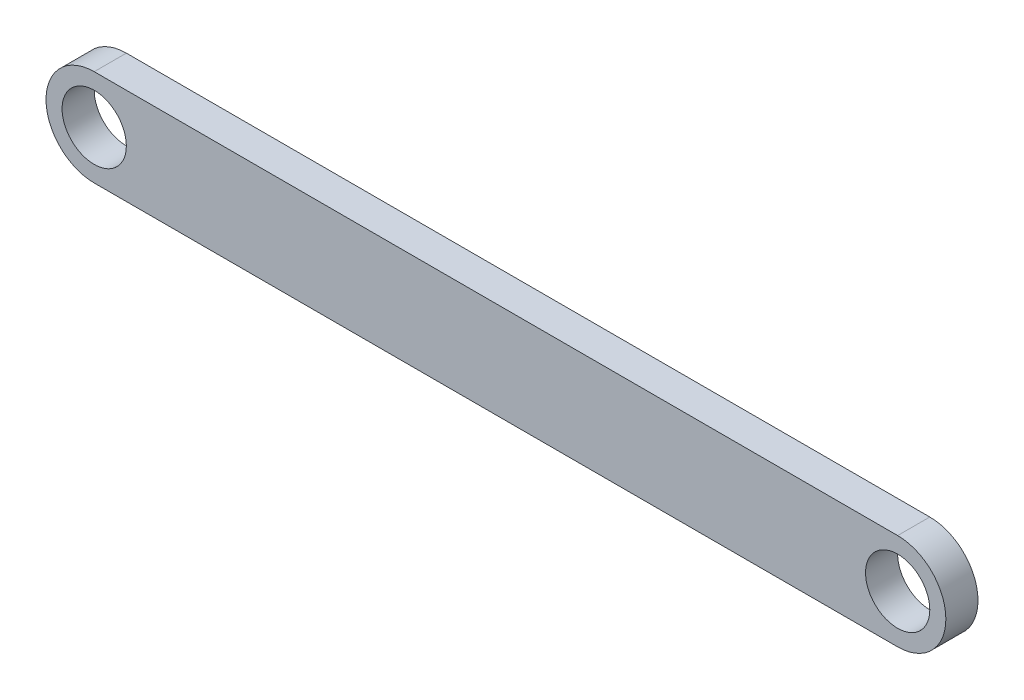
ISO-10303-21;
HEADER;
FILE_DESCRIPTION(('STEP AP214'),'2;1');
FILE_NAME('part.step','',(''),(''),'','','');
FILE_SCHEMA(('AUTOMOTIVE_DESIGN { 1 0 10303 214 1 1 1 1 }'));
ENDSEC;
DATA;
#1=APPLICATION_CONTEXT('core data for automotive mechanical design processes');
#2=APPLICATION_PROTOCOL_DEFINITION('international standard','automotive_design',2000,#1);
#3=PRODUCT_CONTEXT('',#1,'mechanical');
#4=PRODUCT('Part','Part','',(#3));
#5=PRODUCT_RELATED_PRODUCT_CATEGORY('part','',(#4));
#6=PRODUCT_DEFINITION_FORMATION('','',#4);
#7=PRODUCT_DEFINITION_CONTEXT('part definition',#1,'design');
#8=PRODUCT_DEFINITION('design','',#6,#7);
#9=PRODUCT_DEFINITION_SHAPE('','',#8);
#10=(LENGTH_UNIT() NAMED_UNIT(*) SI_UNIT(.MILLI.,.METRE.));
#11=(NAMED_UNIT(*) PLANE_ANGLE_UNIT() SI_UNIT($,.RADIAN.));
#12=(NAMED_UNIT(*) SI_UNIT($,.STERADIAN.) SOLID_ANGLE_UNIT());
#13=UNCERTAINTY_MEASURE_WITH_UNIT(LENGTH_MEASURE(1.E-05),#10,'distance_accuracy_value','');
#14=(GEOMETRIC_REPRESENTATION_CONTEXT(3) GLOBAL_UNCERTAINTY_ASSIGNED_CONTEXT((#13)) GLOBAL_UNIT_ASSIGNED_CONTEXT((#10,
#11,#12)) REPRESENTATION_CONTEXT('',''));
#15=CARTESIAN_POINT('',(0.,0.,0.));
#16=DIRECTION('',(0.,0.,1.));
#17=DIRECTION('',(1.,0.,0.));
#18=AXIS2_PLACEMENT_3D('',#15,#16,#17);
#19=CARTESIAN_POINT('',(-75.8515243902439,4.53018292682928,6.35));
#20=DIRECTION('',(0.,0.,1.));
#21=DIRECTION('',(1.,0.,0.));
#22=AXIS2_PLACEMENT_3D('',#19,#20,#21);
#23=PLANE('',#22);
#24=CARTESIAN_POINT('',(-75.8515243902439,4.53018292682928,6.35));
#25=DIRECTION('',(0.,0.,1.));
#26=DIRECTION('',(1.,0.,0.));
#27=AXIS2_PLACEMENT_3D('',#24,#25,#26);
#28=CIRCLE('',#27,6.35);
#29=CARTESIAN_POINT('',(-69.5015243902439,4.53018292682928,6.35));
#30=VERTEX_POINT('',#29);
#31=EDGE_CURVE('E114',#30,#30,#28,.T.);
#32=ORIENTED_EDGE('',*,*,#31,.F.);
#33=EDGE_LOOP('',(#32));
#34=FACE_BOUND('',#33,.T.);
#35=CARTESIAN_POINT('',(-75.8515243902439,4.53018292682928,6.35));
#36=DIRECTION('',(0.,0.,1.));
#37=DIRECTION('',(1.,0.,0.));
#38=AXIS2_PLACEMENT_3D('',#35,#36,#37);
#39=CIRCLE('',#38,9.525);
#40=CARTESIAN_POINT('',(-75.8515243902439,14.0551829268293,6.35));
#41=VERTEX_POINT('',#40);
#42=CARTESIAN_POINT('',(-75.8515243902439,-4.99481707317073,6.35));
#43=VERTEX_POINT('',#42);
#44=EDGE_CURVE('E94',#41,#43,#39,.T.);
#45=ORIENTED_EDGE('',*,*,#44,.T.);
#46=DIRECTION('',(1.,0.,0.));
#47=VECTOR('',#46,1.);
#48=CARTESIAN_POINT('',(-75.8515243902439,-4.99481707317073,6.35));
#49=LINE('',#48,#47);
#50=CARTESIAN_POINT('',(82.8984756097561,-4.99481707317073,6.35));
#51=VERTEX_POINT('',#50);
#52=EDGE_CURVE('E89',#43,#51,#49,.T.);
#53=ORIENTED_EDGE('',*,*,#52,.T.);
#54=CARTESIAN_POINT('',(82.8984756097561,4.53018292682928,6.35));
#55=DIRECTION('',(0.,0.,1.));
#56=DIRECTION('',(-1.,0.,0.));
#57=AXIS2_PLACEMENT_3D('',#54,#55,#56);
#58=CIRCLE('',#57,9.525);
#59=CARTESIAN_POINT('',(82.8984756097561,14.0551829268293,6.35));
#60=VERTEX_POINT('',#59);
#61=EDGE_CURVE('E92',#51,#60,#58,.T.);
#62=ORIENTED_EDGE('',*,*,#61,.T.);
#63=DIRECTION('',(-1.,0.,0.));
#64=VECTOR('',#63,1.);
#65=CARTESIAN_POINT('',(-75.8515243902439,14.0551829268293,6.35));
#66=LINE('',#65,#64);
#67=EDGE_CURVE('E59',#60,#41,#66,.T.);
#68=ORIENTED_EDGE('',*,*,#67,.T.);
#69=EDGE_LOOP('',(#45,#53,#62,#68));
#70=FACE_BOUND('',#69,.T.);
#71=CARTESIAN_POINT('',(82.8984756097561,4.53018292682928,6.35));
#72=DIRECTION('',(0.,0.,1.));
#73=DIRECTION('',(1.,0.,0.));
#74=AXIS2_PLACEMENT_3D('',#71,#72,#73);
#75=CIRCLE('',#74,6.35);
#76=CARTESIAN_POINT('',(89.2484756097561,4.53018292682928,6.35));
#77=VERTEX_POINT('',#76);
#78=EDGE_CURVE('E136',#77,#77,#75,.T.);
#79=ORIENTED_EDGE('',*,*,#78,.F.);
#80=EDGE_LOOP('',(#79));
#81=FACE_BOUND('',#80,.T.);
#82=ADVANCED_FACE('F41',(#34,#70,#81),#23,.T.);
#83=CARTESIAN_POINT('',(-75.8515243902439,4.53018292682928,0.));
#84=DIRECTION('',(0.,0.,1.));
#85=DIRECTION('',(1.,0.,0.));
#86=AXIS2_PLACEMENT_3D('',#83,#84,#85);
#87=PLANE('',#86);
#88=CARTESIAN_POINT('',(-75.8515243902439,4.53018292682928,0.));
#89=DIRECTION('',(0.,0.,1.));
#90=DIRECTION('',(1.,0.,0.));
#91=AXIS2_PLACEMENT_3D('',#88,#89,#90);
#92=CIRCLE('',#91,9.525);
#93=CARTESIAN_POINT('',(-75.8515243902439,14.0551829268293,0.));
#94=VERTEX_POINT('',#93);
#95=CARTESIAN_POINT('',(-75.8515243902439,-4.99481707317073,0.));
#96=VERTEX_POINT('',#95);
#97=EDGE_CURVE('E110',#94,#96,#92,.T.);
#98=ORIENTED_EDGE('',*,*,#97,.F.);
#99=DIRECTION('',(-1.,0.,0.));
#100=VECTOR('',#99,1.);
#101=CARTESIAN_POINT('',(-75.8515243902439,14.0551829268293,0.));
#102=LINE('',#101,#100);
#103=CARTESIAN_POINT('',(82.8984756097561,14.0551829268293,0.));
#104=VERTEX_POINT('',#103);
#105=EDGE_CURVE('E82',#104,#94,#102,.T.);
#106=ORIENTED_EDGE('',*,*,#105,.F.);
#107=CARTESIAN_POINT('',(82.8984756097561,4.53018292682928,0.));
#108=DIRECTION('',(0.,0.,1.));
#109=DIRECTION('',(-1.,0.,0.));
#110=AXIS2_PLACEMENT_3D('',#107,#108,#109);
#111=CIRCLE('',#110,9.525);
#112=CARTESIAN_POINT('',(82.8984756097561,-4.99481707317073,0.));
#113=VERTEX_POINT('',#112);
#114=EDGE_CURVE('E76',#113,#104,#111,.T.);
#115=ORIENTED_EDGE('',*,*,#114,.F.);
#116=DIRECTION('',(1.,0.,0.));
#117=VECTOR('',#116,1.);
#118=CARTESIAN_POINT('',(-75.8515243902439,-4.99481707317073,0.));
#119=LINE('',#118,#117);
#120=EDGE_CURVE('E99',#96,#113,#119,.T.);
#121=ORIENTED_EDGE('',*,*,#120,.F.);
#122=EDGE_LOOP('',(#98,#106,#115,#121));
#123=FACE_BOUND('',#122,.T.);
#124=CARTESIAN_POINT('',(-75.8515243902439,4.53018292682928,0.));
#125=DIRECTION('',(0.,0.,1.));
#126=DIRECTION('',(1.,0.,0.));
#127=AXIS2_PLACEMENT_3D('',#124,#125,#126);
#128=CIRCLE('',#127,6.35);
#129=CARTESIAN_POINT('',(-69.5015243902439,4.53018292682928,0.));
#130=VERTEX_POINT('',#129);
#131=EDGE_CURVE('E132',#130,#130,#128,.T.);
#132=ORIENTED_EDGE('',*,*,#131,.T.);
#133=EDGE_LOOP('',(#132));
#134=FACE_BOUND('',#133,.T.);
#135=CARTESIAN_POINT('',(82.8984756097561,4.53018292682928,0.));
#136=DIRECTION('',(0.,0.,1.));
#137=DIRECTION('',(1.,0.,0.));
#138=AXIS2_PLACEMENT_3D('',#135,#136,#137);
#139=CIRCLE('',#138,6.35);
#140=CARTESIAN_POINT('',(89.2484756097561,4.53018292682928,0.));
#141=VERTEX_POINT('',#140);
#142=EDGE_CURVE('E140',#141,#141,#139,.T.);
#143=ORIENTED_EDGE('',*,*,#142,.T.);
#144=EDGE_LOOP('',(#143));
#145=FACE_BOUND('',#144,.T.);
#146=ADVANCED_FACE('F127',(#123,#134,#145),#87,.F.);
#147=CARTESIAN_POINT('',(-75.8515243902439,4.53018292682928,6.35));
#148=DIRECTION('',(0.,0.,-1.));
#149=DIRECTION('',(-1.,0.,0.));
#150=AXIS2_PLACEMENT_3D('',#147,#148,#149);
#151=CYLINDRICAL_SURFACE('',#150,9.525);
#152=ORIENTED_EDGE('',*,*,#97,.T.);
#153=DIRECTION('',(0.,0.,-1.));
#154=VECTOR('',#153,1.);
#155=CARTESIAN_POINT('',(-75.8515243902439,-4.99481707317073,6.35));
#156=LINE('',#155,#154);
#157=EDGE_CURVE('E11',#43,#96,#156,.T.);
#158=ORIENTED_EDGE('',*,*,#157,.F.);
#159=ORIENTED_EDGE('',*,*,#44,.F.);
#160=DIRECTION('',(0.,0.,-1.));
#161=VECTOR('',#160,1.);
#162=CARTESIAN_POINT('',(-75.8515243902439,14.0551829268293,6.35));
#163=LINE('',#162,#161);
#164=EDGE_CURVE('E106',#41,#94,#163,.T.);
#165=ORIENTED_EDGE('',*,*,#164,.T.);
#166=EDGE_LOOP('',(#152,#158,#159,#165));
#167=FACE_BOUND('',#166,.T.);
#168=ADVANCED_FACE('F43',(#167),#151,.T.);
#169=CARTESIAN_POINT('',(-75.8515243902439,-4.99481707317073,6.35));
#170=DIRECTION('',(0.,1.,0.));
#171=DIRECTION('',(-1.,0.,0.));
#172=AXIS2_PLACEMENT_3D('',#169,#170,#171);
#173=PLANE('',#172);
#174=ORIENTED_EDGE('',*,*,#120,.T.);
#175=DIRECTION('',(0.,0.,-1.));
#176=VECTOR('',#175,1.);
#177=CARTESIAN_POINT('',(82.8984756097561,-4.99481707317073,6.35));
#178=LINE('',#177,#176);
#179=EDGE_CURVE('E51',#51,#113,#178,.T.);
#180=ORIENTED_EDGE('',*,*,#179,.F.);
#181=ORIENTED_EDGE('',*,*,#52,.F.);
#182=ORIENTED_EDGE('',*,*,#157,.T.);
#183=EDGE_LOOP('',(#174,#180,#181,#182));
#184=FACE_BOUND('',#183,.T.);
#185=ADVANCED_FACE('F98',(#184),#173,.F.);
#186=CARTESIAN_POINT('',(82.8984756097561,4.53018292682928,6.35));
#187=DIRECTION('',(0.,0.,-1.));
#188=DIRECTION('',(-1.,0.,0.));
#189=AXIS2_PLACEMENT_3D('',#186,#187,#188);
#190=CYLINDRICAL_SURFACE('',#189,9.525);
#191=ORIENTED_EDGE('',*,*,#114,.T.);
#192=DIRECTION('',(0.,0.,-1.));
#193=VECTOR('',#192,1.);
#194=CARTESIAN_POINT('',(82.8984756097561,14.0551829268293,6.35));
#195=LINE('',#194,#193);
#196=EDGE_CURVE('E101',#60,#104,#195,.T.);
#197=ORIENTED_EDGE('',*,*,#196,.F.);
#198=ORIENTED_EDGE('',*,*,#61,.F.);
#199=ORIENTED_EDGE('',*,*,#179,.T.);
#200=EDGE_LOOP('',(#191,#197,#198,#199));
#201=FACE_BOUND('',#200,.T.);
#202=ADVANCED_FACE('F102',(#201),#190,.T.);
#203=CARTESIAN_POINT('',(-75.8515243902439,14.0551829268293,6.35));
#204=DIRECTION('',(0.,-1.,0.));
#205=DIRECTION('',(1.,0.,0.));
#206=AXIS2_PLACEMENT_3D('',#203,#204,#205);
#207=PLANE('',#206);
#208=ORIENTED_EDGE('',*,*,#105,.T.);
#209=ORIENTED_EDGE('',*,*,#164,.F.);
#210=ORIENTED_EDGE('',*,*,#67,.F.);
#211=ORIENTED_EDGE('',*,*,#196,.T.);
#212=EDGE_LOOP('',(#208,#209,#210,#211));
#213=FACE_BOUND('',#212,.T.);
#214=ADVANCED_FACE('F124',(#213),#207,.F.);
#215=CARTESIAN_POINT('',(-75.8515243902439,4.53018292682928,6.35));
#216=DIRECTION('',(0.,0.,-1.));
#217=DIRECTION('',(-1.,0.,0.));
#218=AXIS2_PLACEMENT_3D('',#215,#216,#217);
#219=CYLINDRICAL_SURFACE('',#218,6.35);
#220=ORIENTED_EDGE('',*,*,#31,.T.);
#221=EDGE_LOOP('',(#220));
#222=FACE_BOUND('',#221,.T.);
#223=ORIENTED_EDGE('',*,*,#131,.F.);
#224=EDGE_LOOP('',(#223));
#225=FACE_BOUND('',#224,.T.);
#226=ADVANCED_FACE('F159',(#222,#225),#219,.F.);
#227=CARTESIAN_POINT('',(82.8984756097561,4.53018292682928,6.35));
#228=DIRECTION('',(0.,0.,-1.));
#229=DIRECTION('',(-1.,0.,0.));
#230=AXIS2_PLACEMENT_3D('',#227,#228,#229);
#231=CYLINDRICAL_SURFACE('',#230,6.35);
#232=ORIENTED_EDGE('',*,*,#78,.T.);
#233=EDGE_LOOP('',(#232));
#234=FACE_BOUND('',#233,.T.);
#235=ORIENTED_EDGE('',*,*,#142,.F.);
#236=EDGE_LOOP('',(#235));
#237=FACE_BOUND('',#236,.T.);
#238=ADVANCED_FACE('F148',(#234,#237),#231,.F.);
#239=CLOSED_SHELL('',(#82,#146,#168,#185,#202,#214,#226,#238));
#240=MANIFOLD_SOLID_BREP('B2',#239);
#241=ADVANCED_BREP_SHAPE_REPRESENTATION('',(#18,#240),#14);
#242=SHAPE_DEFINITION_REPRESENTATION(#9,#241);
ENDSEC;
END-ISO-10303-21;
